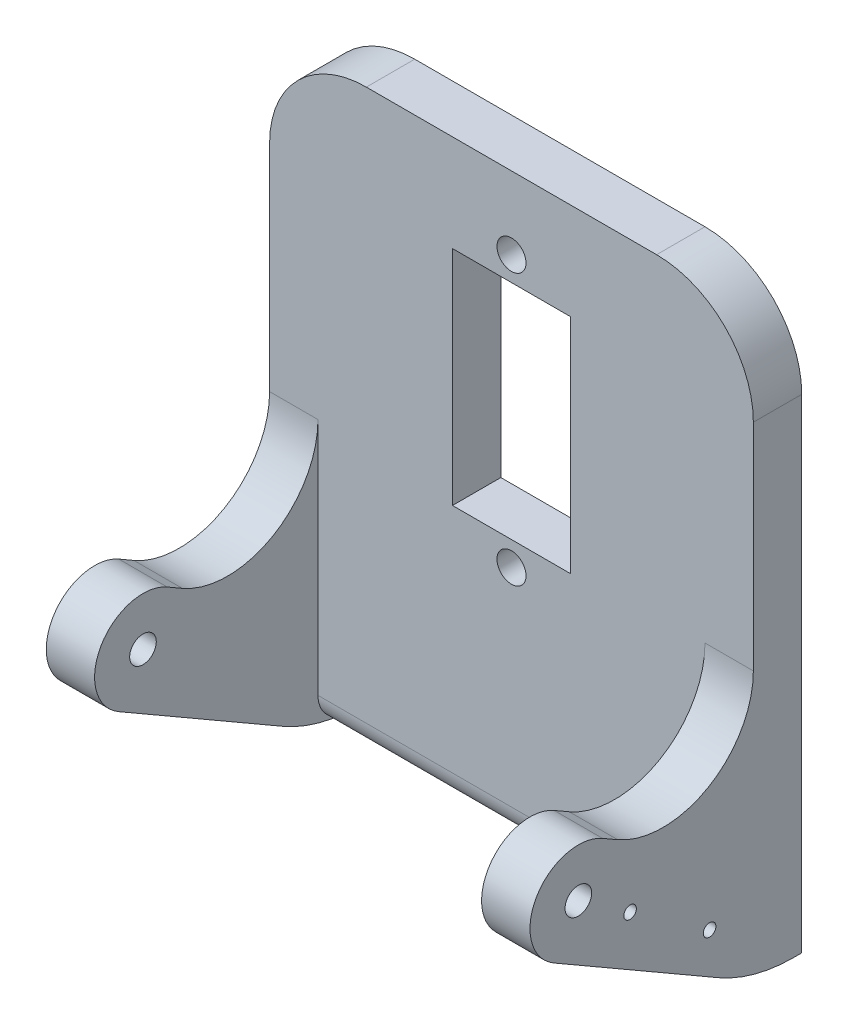
ISO-10303-21;
HEADER;
FILE_DESCRIPTION(('STEP AP214'),'2;1');
FILE_NAME('part.step','',(''),(''),'','','');
FILE_SCHEMA(('AUTOMOTIVE_DESIGN { 1 0 10303 214 1 1 1 1 }'));
ENDSEC;
DATA;
#1=APPLICATION_CONTEXT('core data for automotive mechanical design processes');
#2=APPLICATION_PROTOCOL_DEFINITION('international standard','automotive_design',2000,#1);
#3=PRODUCT_CONTEXT('',#1,'mechanical');
#4=PRODUCT('Part','Part','',(#3));
#5=PRODUCT_RELATED_PRODUCT_CATEGORY('part','',(#4));
#6=PRODUCT_DEFINITION_FORMATION('','',#4);
#7=PRODUCT_DEFINITION_CONTEXT('part definition',#1,'design');
#8=PRODUCT_DEFINITION('design','',#6,#7);
#9=PRODUCT_DEFINITION_SHAPE('','',#8);
#10=(LENGTH_UNIT() NAMED_UNIT(*) SI_UNIT(.MILLI.,.METRE.));
#11=(NAMED_UNIT(*) PLANE_ANGLE_UNIT() SI_UNIT($,.RADIAN.));
#12=(NAMED_UNIT(*) SI_UNIT($,.STERADIAN.) SOLID_ANGLE_UNIT());
#13=UNCERTAINTY_MEASURE_WITH_UNIT(LENGTH_MEASURE(1.E-05),#10,'distance_accuracy_value','');
#14=(GEOMETRIC_REPRESENTATION_CONTEXT(3) GLOBAL_UNCERTAINTY_ASSIGNED_CONTEXT((#13)) GLOBAL_UNIT_ASSIGNED_CONTEXT((#10,
#11,#12)) REPRESENTATION_CONTEXT('',''));
#15=CARTESIAN_POINT('',(0.,0.,0.));
#16=DIRECTION('',(0.,0.,1.));
#17=DIRECTION('',(1.,0.,0.));
#18=AXIS2_PLACEMENT_3D('',#15,#16,#17);
#19=CARTESIAN_POINT('',(-20.,-14.5,0.846787517317614));
#20=DIRECTION('',(1.,0.,0.));
#21=DIRECTION('',(0.,0.,-1.));
#22=AXIS2_PLACEMENT_3D('',#19,#20,#21);
#23=CYLINDRICAL_SURFACE('',#22,15.5);
#24=CARTESIAN_POINT('',(20.,-14.5,0.846787517317622));
#25=DIRECTION('',(-1.,0.,0.));
#26=DIRECTION('',(0.,0.,1.));
#27=AXIS2_PLACEMENT_3D('',#24,#25,#26);
#28=CIRCLE('',#27,15.5);
#29=CARTESIAN_POINT('',(20.,-29.9338960489937,2.27677099584378));
#30=VERTEX_POINT('',#29);
#31=CARTESIAN_POINT('',(20.,-27.9233937586588,8.59678751731759));
#32=VERTEX_POINT('',#31);
#33=EDGE_CURVE('E394',#30,#32,#28,.T.);
#34=ORIENTED_EDGE('',*,*,#33,.F.);
#35=DIRECTION('',(1.,0.,0.));
#36=VECTOR('',#35,1.);
#37=CARTESIAN_POINT('',(-20.,-29.9338960489937,2.27677099584377));
#38=LINE('',#37,#36);
#39=CARTESIAN_POINT('',(-20.,-29.9338960489937,2.27677099584377));
#40=VERTEX_POINT('',#39);
#41=EDGE_CURVE('E411',#30,#40,#38,.F.);
#42=ORIENTED_EDGE('',*,*,#41,.T.);
#43=CARTESIAN_POINT('',(-20.,-14.5,0.846787517317614));
#44=DIRECTION('',(1.,0.,0.));
#45=DIRECTION('',(0.,0.,-1.));
#46=AXIS2_PLACEMENT_3D('',#43,#44,#45);
#47=CIRCLE('',#46,15.5);
#48=CARTESIAN_POINT('',(-20.,-27.9233937586588,8.59678751731758));
#49=VERTEX_POINT('',#48);
#50=EDGE_CURVE('E392',#49,#40,#47,.T.);
#51=ORIENTED_EDGE('',*,*,#50,.F.);
#52=DIRECTION('',(1.,0.,0.));
#53=VECTOR('',#52,1.);
#54=CARTESIAN_POINT('',(-20.,-27.9233937586588,8.59678751731758));
#55=LINE('',#54,#53);
#56=CARTESIAN_POINT('',(-25.,-27.9233937586588,8.59678751731758));
#57=VERTEX_POINT('',#56);
#58=EDGE_CURVE('E384',#57,#49,#55,.T.);
#59=ORIENTED_EDGE('',*,*,#58,.F.);
#60=CARTESIAN_POINT('',(-25.,-14.5,0.846787517317613));
#61=DIRECTION('',(1.,0.,0.));
#62=DIRECTION('',(0.,1.,0.));
#63=AXIS2_PLACEMENT_3D('',#60,#61,#62);
#64=CIRCLE('',#63,15.5);
#65=CARTESIAN_POINT('',(-25.,-30.,0.846787517317624));
#66=VERTEX_POINT('',#65);
#67=EDGE_CURVE('E406',#66,#57,#64,.F.);
#68=ORIENTED_EDGE('',*,*,#67,.F.);
#69=DIRECTION('',(1.,0.,0.));
#70=VECTOR('',#69,1.);
#71=CARTESIAN_POINT('',(-25.,-30.,0.846787517317614));
#72=LINE('',#71,#70);
#73=CARTESIAN_POINT('',(25.,-30.,0.846787517317632));
#74=VERTEX_POINT('',#73);
#75=EDGE_CURVE('E403',#74,#66,#72,.F.);
#76=ORIENTED_EDGE('',*,*,#75,.F.);
#77=CARTESIAN_POINT('',(25.,-14.5,0.846787517317623));
#78=DIRECTION('',(-1.,0.,0.));
#79=DIRECTION('',(0.,-1.,0.));
#80=AXIS2_PLACEMENT_3D('',#77,#78,#79);
#81=CIRCLE('',#80,15.5);
#82=CARTESIAN_POINT('',(25.,-27.9233937586588,8.59678751731759));
#83=VERTEX_POINT('',#82);
#84=EDGE_CURVE('E400',#83,#74,#81,.F.);
#85=ORIENTED_EDGE('',*,*,#84,.F.);
#86=DIRECTION('',(1.,0.,0.));
#87=VECTOR('',#86,1.);
#88=CARTESIAN_POINT('',(-20.,-27.9233937586588,8.59678751731758));
#89=LINE('',#88,#87);
#90=EDGE_CURVE('E397',#32,#83,#89,.T.);
#91=ORIENTED_EDGE('',*,*,#90,.F.);
#92=EDGE_LOOP('',(#34,#42,#51,#59,#68,#76,#85,#91));
#93=FACE_BOUND('',#92,.T.);
#94=ADVANCED_FACE('F35',(#93),#23,.T.);
#95=CARTESIAN_POINT('',(0.,-2.25831956543856,14.35));
#96=DIRECTION('',(1.,0.,0.));
#97=DIRECTION('',(0.,1.,0.));
#98=AXIS2_PLACEMENT_3D('',#95,#96,#97);
#99=CYLINDRICAL_SURFACE('',#98,9.35);
#100=DIRECTION('',(1.,0.,0.));
#101=VECTOR('',#100,1.);
#102=CARTESIAN_POINT('',(0.,-2.25831956543856,5.));
#103=LINE('',#102,#101);
#104=CARTESIAN_POINT('',(-25.,-2.25831956543855,5.));
#105=VERTEX_POINT('',#104);
#106=CARTESIAN_POINT('',(-20.,-2.25831956543855,5.));
#107=VERTEX_POINT('',#106);
#108=EDGE_CURVE('E373',#105,#107,#103,.T.);
#109=ORIENTED_EDGE('',*,*,#108,.F.);
#110=CARTESIAN_POINT('',(-25.,-2.25831956543855,14.35));
#111=DIRECTION('',(1.,0.,0.));
#112=DIRECTION('',(0.,1.,0.));
#113=AXIS2_PLACEMENT_3D('',#110,#111,#112);
#114=CIRCLE('',#113,9.35);
#115=CARTESIAN_POINT('',(-25.,-10.3556570908231,19.025));
#116=VERTEX_POINT('',#115);
#117=EDGE_CURVE('E379',#105,#116,#114,.F.);
#118=ORIENTED_EDGE('',*,*,#117,.T.);
#119=DIRECTION('',(1.,0.,0.));
#120=VECTOR('',#119,1.);
#121=CARTESIAN_POINT('',(-20.,-10.3556570908231,19.025));
#122=LINE('',#121,#120);
#123=CARTESIAN_POINT('',(-20.,-10.3556570908231,19.025));
#124=VERTEX_POINT('',#123);
#125=EDGE_CURVE('E376',#124,#116,#122,.F.);
#126=ORIENTED_EDGE('',*,*,#125,.F.);
#127=CARTESIAN_POINT('',(-20.,-2.25831956543855,14.35));
#128=DIRECTION('',(1.,0.,0.));
#129=DIRECTION('',(0.,0.,-1.));
#130=AXIS2_PLACEMENT_3D('',#127,#128,#129);
#131=CIRCLE('',#130,9.35);
#132=EDGE_CURVE('E381',#124,#107,#131,.T.);
#133=ORIENTED_EDGE('',*,*,#132,.T.);
#134=EDGE_LOOP('',(#109,#118,#126,#133));
#135=FACE_BOUND('',#134,.T.);
#136=ADVANCED_FACE('F460',(#135),#99,.F.);
#137=CARTESIAN_POINT('',(-25.,-13.7831216351297,23.0884572681199));
#138=DIRECTION('',(-1.,0.,0.));
#139=DIRECTION('',(0.,-1.,0.));
#140=AXIS2_PLACEMENT_3D('',#137,#138,#139);
#141=CYLINDRICAL_SURFACE('',#140,5.);
#142=DIRECTION('',(-1.,0.,0.));
#143=VECTOR('',#142,1.);
#144=CARTESIAN_POINT('',(-20.,-9.45299461620754,20.5884572681199));
#145=LINE('',#144,#143);
#146=CARTESIAN_POINT('',(-25.,-9.45299461620754,20.5884572681199));
#147=VERTEX_POINT('',#146);
#148=CARTESIAN_POINT('',(-20.,-9.45299461620754,20.5884572681199));
#149=VERTEX_POINT('',#148);
#150=EDGE_CURVE('E353',#147,#149,#145,.F.);
#151=ORIENTED_EDGE('',*,*,#150,.F.);
#152=CARTESIAN_POINT('',(-25.,-13.7831216351297,23.0884572681199));
#153=DIRECTION('',(1.,0.,0.));
#154=DIRECTION('',(0.,1.,0.));
#155=AXIS2_PLACEMENT_3D('',#152,#153,#154);
#156=CIRCLE('',#155,5.);
#157=CARTESIAN_POINT('',(-25.,-18.1132486540519,25.5884572681199));
#158=VERTEX_POINT('',#157);
#159=EDGE_CURVE('E368',#158,#147,#156,.F.);
#160=ORIENTED_EDGE('',*,*,#159,.F.);
#161=DIRECTION('',(-1.,0.,0.));
#162=VECTOR('',#161,1.);
#163=CARTESIAN_POINT('',(-20.,-18.1132486540519,25.5884572681199));
#164=LINE('',#163,#162);
#165=CARTESIAN_POINT('',(-20.,-18.1132486540519,25.5884572681199));
#166=VERTEX_POINT('',#165);
#167=EDGE_CURVE('E365',#166,#158,#164,.T.);
#168=ORIENTED_EDGE('',*,*,#167,.F.);
#169=CARTESIAN_POINT('',(-20.,-13.7831216351297,23.0884572681199));
#170=DIRECTION('',(1.,0.,0.));
#171=DIRECTION('',(0.,0.,-1.));
#172=AXIS2_PLACEMENT_3D('',#169,#170,#171);
#173=CIRCLE('',#172,5.);
#174=EDGE_CURVE('E371',#149,#166,#173,.T.);
#175=ORIENTED_EDGE('',*,*,#174,.F.);
#176=EDGE_LOOP('',(#151,#160,#168,#175));
#177=FACE_BOUND('',#176,.T.);
#178=ADVANCED_FACE('F466',(#177),#141,.T.);
#179=CARTESIAN_POINT('',(0.,0.,5.));
#180=DIRECTION('',(0.,0.,1.));
#181=DIRECTION('',(1.,0.,0.));
#182=AXIS2_PLACEMENT_3D('',#179,#180,#181);
#183=PLANE('',#182);
#184=CARTESIAN_POINT('',(0.,-5.50000000000001,5.));
#185=DIRECTION('',(0.,0.,-1.));
#186=DIRECTION('',(-1.,0.,0.));
#187=AXIS2_PLACEMENT_3D('',#184,#185,#186);
#188=CIRCLE('',#187,1.5);
#189=CARTESIAN_POINT('',(-1.50000000000001,-5.50000000000001,5.));
#190=VERTEX_POINT('',#189);
#191=EDGE_CURVE('E268',#190,#190,#188,.T.);
#192=ORIENTED_EDGE('',*,*,#191,.T.);
#193=EDGE_LOOP('',(#192));
#194=FACE_BOUND('',#193,.T.);
#195=CARTESIAN_POINT('',(0.,22.5,5.));
#196=DIRECTION('',(0.,0.,-1.));
#197=DIRECTION('',(-1.,0.,0.));
#198=AXIS2_PLACEMENT_3D('',#195,#196,#197);
#199=CIRCLE('',#198,1.5);
#200=CARTESIAN_POINT('',(-1.50000000000001,22.5,5.));
#201=VERTEX_POINT('',#200);
#202=EDGE_CURVE('E275',#201,#201,#199,.T.);
#203=ORIENTED_EDGE('',*,*,#202,.T.);
#204=EDGE_LOOP('',(#203));
#205=FACE_BOUND('',#204,.T.);
#206=DIRECTION('',(0.,1.,0.));
#207=VECTOR('',#206,1.);
#208=CARTESIAN_POINT('',(6.1,-3.,5.));
#209=LINE('',#208,#207);
#210=CARTESIAN_POINT('',(6.1,-3.,5.));
#211=VERTEX_POINT('',#210);
#212=CARTESIAN_POINT('',(6.1,20.,5.));
#213=VERTEX_POINT('',#212);
#214=EDGE_CURVE('E271',#211,#213,#209,.T.);
#215=ORIENTED_EDGE('',*,*,#214,.F.);
#216=DIRECTION('',(1.,0.,0.));
#217=VECTOR('',#216,1.);
#218=CARTESIAN_POINT('',(6.1,-3.,5.));
#219=LINE('',#218,#217);
#220=CARTESIAN_POINT('',(-6.10000000000001,-3.,5.));
#221=VERTEX_POINT('',#220);
#222=EDGE_CURVE('E284',#221,#211,#219,.T.);
#223=ORIENTED_EDGE('',*,*,#222,.F.);
#224=DIRECTION('',(0.,-1.,0.));
#225=VECTOR('',#224,1.);
#226=CARTESIAN_POINT('',(-6.10000000000001,-3.,5.));
#227=LINE('',#226,#225);
#228=CARTESIAN_POINT('',(-6.10000000000001,20.,5.));
#229=VERTEX_POINT('',#228);
#230=EDGE_CURVE('E298',#229,#221,#227,.T.);
#231=ORIENTED_EDGE('',*,*,#230,.F.);
#232=DIRECTION('',(-1.,0.,0.));
#233=VECTOR('',#232,1.);
#234=CARTESIAN_POINT('',(6.1,20.,5.));
#235=LINE('',#234,#233);
#236=EDGE_CURVE('E295',#213,#229,#235,.T.);
#237=ORIENTED_EDGE('',*,*,#236,.F.);
#238=EDGE_LOOP('',(#215,#223,#231,#237));
#239=FACE_BOUND('',#238,.T.);
#240=DIRECTION('',(0.,1.,0.));
#241=VECTOR('',#240,1.);
#242=CARTESIAN_POINT('',(25.,30.,5.));
#243=LINE('',#242,#241);
#244=CARTESIAN_POINT('',(25.,-2.25831956543855,5.));
#245=VERTEX_POINT('',#244);
#246=CARTESIAN_POINT('',(25.,20.,5.));
#247=VERTEX_POINT('',#246);
#248=EDGE_CURVE('E312',#245,#247,#243,.T.);
#249=ORIENTED_EDGE('',*,*,#248,.T.);
#250=CARTESIAN_POINT('',(15.,20.,5.));
#251=DIRECTION('',(0.,0.,1.));
#252=DIRECTION('',(1.,0.,0.));
#253=AXIS2_PLACEMENT_3D('',#250,#251,#252);
#254=CIRCLE('',#253,10.);
#255=CARTESIAN_POINT('',(15.,30.,5.));
#256=VERTEX_POINT('',#255);
#257=EDGE_CURVE('E43',#247,#256,#254,.T.);
#258=ORIENTED_EDGE('',*,*,#257,.T.);
#259=DIRECTION('',(-1.,0.,0.));
#260=VECTOR('',#259,1.);
#261=CARTESIAN_POINT('',(-25.,30.,5.));
#262=LINE('',#261,#260);
#263=CARTESIAN_POINT('',(-15.,30.,5.));
#264=VERTEX_POINT('',#263);
#265=EDGE_CURVE('E314',#256,#264,#262,.T.);
#266=ORIENTED_EDGE('',*,*,#265,.T.);
#267=CARTESIAN_POINT('',(-15.,20.,5.));
#268=DIRECTION('',(0.,0.,1.));
#269=DIRECTION('',(1.,0.,0.));
#270=AXIS2_PLACEMENT_3D('',#267,#268,#269);
#271=CIRCLE('',#270,10.);
#272=CARTESIAN_POINT('',(-25.,20.,5.));
#273=VERTEX_POINT('',#272);
#274=EDGE_CURVE('E50',#264,#273,#271,.T.);
#275=ORIENTED_EDGE('',*,*,#274,.T.);
#276=DIRECTION('',(0.,-1.,0.));
#277=VECTOR('',#276,1.);
#278=CARTESIAN_POINT('',(-25.,30.,5.));
#279=LINE('',#278,#277);
#280=EDGE_CURVE('E317',#273,#105,#279,.T.);
#281=ORIENTED_EDGE('',*,*,#280,.T.);
#282=ORIENTED_EDGE('',*,*,#108,.T.);
#283=DIRECTION('',(0.,1.,0.));
#284=VECTOR('',#283,1.);
#285=CARTESIAN_POINT('',(-20.,-30.,5.));
#286=LINE('',#285,#284);
#287=CARTESIAN_POINT('',(-20.,-26.9466903620917,5.00000000000001));
#288=VERTEX_POINT('',#287);
#289=EDGE_CURVE('E486',#288,#107,#286,.T.);
#290=ORIENTED_EDGE('',*,*,#289,.F.);
#291=DIRECTION('',(1.,0.,0.));
#292=VECTOR('',#291,1.);
#293=CARTESIAN_POINT('',(0.,-26.9466903620917,5.));
#294=LINE('',#293,#292);
#295=CARTESIAN_POINT('',(20.,-26.9466903620917,5.00000000000001));
#296=VERTEX_POINT('',#295);
#297=EDGE_CURVE('E408',#288,#296,#294,.T.);
#298=ORIENTED_EDGE('',*,*,#297,.T.);
#299=DIRECTION('',(0.,1.,0.));
#300=VECTOR('',#299,1.);
#301=CARTESIAN_POINT('',(20.,-30.,5.));
#302=LINE('',#301,#300);
#303=CARTESIAN_POINT('',(20.,-2.25831956543855,5.));
#304=VERTEX_POINT('',#303);
#305=EDGE_CURVE('E256',#296,#304,#302,.T.);
#306=ORIENTED_EDGE('',*,*,#305,.T.);
#307=DIRECTION('',(1.,0.,0.));
#308=VECTOR('',#307,1.);
#309=CARTESIAN_POINT('',(0.,-2.25831956543856,5.));
#310=LINE('',#309,#308);
#311=EDGE_CURVE('E343',#304,#245,#310,.T.);
#312=ORIENTED_EDGE('',*,*,#311,.T.);
#313=EDGE_LOOP('',(#249,#258,#266,#275,#281,#282,#290,#298,#306,#312));
#314=FACE_BOUND('',#313,.T.);
#315=ADVANCED_FACE('F431',(#194,#205,#239,#314),#183,.T.);
#316=CARTESIAN_POINT('',(20.,0.,0.));
#317=DIRECTION('',(-1.,0.,0.));
#318=DIRECTION('',(0.,0.,1.));
#319=AXIS2_PLACEMENT_3D('',#316,#317,#318);
#320=PLANE('',#319);
#321=ORIENTED_EDGE('',*,*,#305,.F.);
#322=CARTESIAN_POINT('',(20.,-26.9466903620917,2.00000000000001));
#323=DIRECTION('',(-1.,0.,0.));
#324=DIRECTION('',(0.,0.,1.));
#325=AXIS2_PLACEMENT_3D('',#322,#323,#324);
#326=CIRCLE('',#325,3.);
#327=EDGE_CURVE('E414',#296,#30,#326,.F.);
#328=ORIENTED_EDGE('',*,*,#327,.T.);
#329=ORIENTED_EDGE('',*,*,#33,.T.);
#330=DIRECTION('',(0.,-0.499999999999998,-0.86602540378444));
#331=VECTOR('',#330,1.);
#332=CARTESIAN_POINT('',(20.,-30.,5.));
#333=LINE('',#332,#331);
#334=CARTESIAN_POINT('',(20.,-18.1132486540519,25.5884572681199));
#335=VERTEX_POINT('',#334);
#336=EDGE_CURVE('E261',#335,#32,#333,.T.);
#337=ORIENTED_EDGE('',*,*,#336,.F.);
#338=CARTESIAN_POINT('',(20.,-13.7831216351297,23.0884572681199));
#339=DIRECTION('',(-1.,0.,0.));
#340=DIRECTION('',(0.,0.,1.));
#341=AXIS2_PLACEMENT_3D('',#338,#339,#340);
#342=CIRCLE('',#341,5.);
#343=CARTESIAN_POINT('',(20.,-9.45299461620754,20.5884572681199));
#344=VERTEX_POINT('',#343);
#345=EDGE_CURVE('E338',#335,#344,#342,.T.);
#346=ORIENTED_EDGE('',*,*,#345,.T.);
#347=DIRECTION('',(0.,0.499999999999998,0.86602540378444));
#348=VECTOR('',#347,1.);
#349=CARTESIAN_POINT('',(20.,-6.95299461620754,24.9185842870421));
#350=LINE('',#349,#348);
#351=CARTESIAN_POINT('',(20.,-10.3556570908231,19.025));
#352=VERTEX_POINT('',#351);
#353=EDGE_CURVE('E258',#352,#344,#350,.T.);
#354=ORIENTED_EDGE('',*,*,#353,.F.);
#355=CARTESIAN_POINT('',(20.,-2.25831956543855,14.35));
#356=DIRECTION('',(-1.,0.,0.));
#357=DIRECTION('',(0.,0.,1.));
#358=AXIS2_PLACEMENT_3D('',#355,#356,#357);
#359=CIRCLE('',#358,9.35);
#360=EDGE_CURVE('E349',#304,#352,#359,.T.);
#361=ORIENTED_EDGE('',*,*,#360,.F.);
#362=EDGE_LOOP('',(#321,#328,#329,#337,#346,#354,#361));
#363=FACE_BOUND('',#362,.T.);
#364=CARTESIAN_POINT('',(20.,-22.9909247677209,9.79007441638017));
#365=DIRECTION('',(-1.,0.,0.));
#366=DIRECTION('',(0.,0.,1.));
#367=AXIS2_PLACEMENT_3D('',#364,#365,#366);
#368=CIRCLE('',#367,1.91571476111171);
#369=CARTESIAN_POINT('',(20.,-21.5168959497368,8.56647232023378));
#370=VERTEX_POINT('',#369);
#371=CARTESIAN_POINT('',(20.,-24.6532831653106,10.7421918481626));
#372=VERTEX_POINT('',#371);
#373=EDGE_CURVE('E242',#370,#372,#368,.T.);
#374=ORIENTED_EDGE('',*,*,#373,.F.);
#375=DIRECTION('',(0.,0.638718310776219,0.769440653643394));
#376=VECTOR('',#375,1.);
#377=CARTESIAN_POINT('',(20.,-16.9488826318122,14.0693913596522));
#378=LINE('',#377,#376);
#379=CARTESIAN_POINT('',(20.,-11.2249027921388,20.9648611073842));
#380=VERTEX_POINT('',#379);
#381=EDGE_CURVE('E216',#370,#380,#378,.T.);
#382=ORIENTED_EDGE('',*,*,#381,.T.);
#383=CARTESIAN_POINT('',(20.,-13.7831216351297,23.0884572681199));
#384=DIRECTION('',(-1.,0.,0.));
#385=DIRECTION('',(0.,0.,1.));
#386=AXIS2_PLACEMENT_3D('',#383,#384,#385);
#387=CIRCLE('',#386,3.32477733126974);
#388=CARTESIAN_POINT('',(20.,-16.85892840058,24.3508189611917));
#389=VERTEX_POINT('',#388);
#390=EDGE_CURVE('E231',#389,#380,#387,.T.);
#391=ORIENTED_EDGE('',*,*,#390,.F.);
#392=DIRECTION('',(0.,0.497003756044566,0.8677483889225));
#393=VECTOR('',#392,1.);
#394=CARTESIAN_POINT('',(20.,-23.1964385882492,13.2857833588518));
#395=LINE('',#394,#393);
#396=EDGE_CURVE('E245',#372,#389,#395,.T.);
#397=ORIENTED_EDGE('',*,*,#396,.F.);
#398=EDGE_LOOP('',(#374,#382,#391,#397));
#399=FACE_BOUND('',#398,.T.);
#400=ADVANCED_FACE('F538',(#363,#399),#320,.T.);
#401=CARTESIAN_POINT('',(0.,-2.25831956543856,14.35));
#402=DIRECTION('',(-1.,0.,0.));
#403=DIRECTION('',(0.,-1.,0.));
#404=AXIS2_PLACEMENT_3D('',#401,#402,#403);
#405=CYLINDRICAL_SURFACE('',#404,9.35);
#406=ORIENTED_EDGE('',*,*,#311,.F.);
#407=ORIENTED_EDGE('',*,*,#360,.T.);
#408=DIRECTION('',(1.,0.,0.));
#409=VECTOR('',#408,1.);
#410=CARTESIAN_POINT('',(0.,-10.3556570908231,19.025));
#411=LINE('',#410,#409);
#412=CARTESIAN_POINT('',(25.,-10.3556570908231,19.025));
#413=VERTEX_POINT('',#412);
#414=EDGE_CURVE('E346',#413,#352,#411,.F.);
#415=ORIENTED_EDGE('',*,*,#414,.F.);
#416=CARTESIAN_POINT('',(25.,-2.25831956543855,14.35));
#417=DIRECTION('',(-1.,0.,0.));
#418=DIRECTION('',(0.,-1.,0.));
#419=AXIS2_PLACEMENT_3D('',#416,#417,#418);
#420=CIRCLE('',#419,9.35);
#421=EDGE_CURVE('E351',#413,#245,#420,.F.);
#422=ORIENTED_EDGE('',*,*,#421,.T.);
#423=EDGE_LOOP('',(#406,#407,#415,#422));
#424=FACE_BOUND('',#423,.T.);
#425=ADVANCED_FACE('F541',(#424),#405,.F.);
#426=CARTESIAN_POINT('',(20.,-13.7831216351297,23.0884572681199));
#427=DIRECTION('',(1.,0.,0.));
#428=DIRECTION('',(0.,1.,0.));
#429=AXIS2_PLACEMENT_3D('',#426,#427,#428);
#430=CYLINDRICAL_SURFACE('',#429,5.);
#431=DIRECTION('',(1.,0.,0.));
#432=VECTOR('',#431,1.);
#433=CARTESIAN_POINT('',(20.,-9.45299461620754,20.5884572681199));
#434=LINE('',#433,#432);
#435=CARTESIAN_POINT('',(25.,-9.45299461620754,20.5884572681199));
#436=VERTEX_POINT('',#435);
#437=EDGE_CURVE('E332',#344,#436,#434,.T.);
#438=ORIENTED_EDGE('',*,*,#437,.F.);
#439=ORIENTED_EDGE('',*,*,#345,.F.);
#440=DIRECTION('',(1.,0.,0.));
#441=VECTOR('',#440,1.);
#442=CARTESIAN_POINT('',(20.,-18.1132486540519,25.5884572681199));
#443=LINE('',#442,#441);
#444=CARTESIAN_POINT('',(25.,-18.1132486540519,25.5884572681199));
#445=VERTEX_POINT('',#444);
#446=EDGE_CURVE('E335',#445,#335,#443,.F.);
#447=ORIENTED_EDGE('',*,*,#446,.F.);
#448=CARTESIAN_POINT('',(25.,-13.7831216351297,23.0884572681199));
#449=DIRECTION('',(-1.,0.,0.));
#450=DIRECTION('',(0.,-1.,0.));
#451=AXIS2_PLACEMENT_3D('',#448,#449,#450);
#452=CIRCLE('',#451,5.);
#453=EDGE_CURVE('E341',#436,#445,#452,.F.);
#454=ORIENTED_EDGE('',*,*,#453,.F.);
#455=EDGE_LOOP('',(#438,#439,#447,#454));
#456=FACE_BOUND('',#455,.T.);
#457=ADVANCED_FACE('F589',(#456),#430,.T.);
#458=CARTESIAN_POINT('',(25.,30.,5.));
#459=DIRECTION('',(-1.,0.,0.));
#460=DIRECTION('',(0.,-1.,0.));
#461=AXIS2_PLACEMENT_3D('',#458,#459,#460);
#462=PLANE('',#461);
#463=CARTESIAN_POINT('',(25.,-23.1759347224715,9.52287352445959));
#464=DIRECTION('',(-1.,0.,0.));
#465=DIRECTION('',(0.,0.,1.));
#466=AXIS2_PLACEMENT_3D('',#463,#464,#465);
#467=CIRCLE('',#466,0.649999999999279);
#468=CARTESIAN_POINT('',(25.,-23.1759347224715,10.1728735244589));
#469=VERTEX_POINT('',#468);
#470=EDGE_CURVE('E358',#469,#469,#467,.T.);
#471=ORIENTED_EDGE('',*,*,#470,.T.);
#472=EDGE_LOOP('',(#471));
#473=FACE_BOUND('',#472,.T.);
#474=CARTESIAN_POINT('',(25.,-17.4833207301432,17.7444394297083));
#475=DIRECTION('',(-1.,0.,0.));
#476=DIRECTION('',(0.,0.,1.));
#477=AXIS2_PLACEMENT_3D('',#474,#475,#476);
#478=CIRCLE('',#477,0.649999999999293);
#479=CARTESIAN_POINT('',(25.,-17.4833207301432,18.3944394297076));
#480=VERTEX_POINT('',#479);
#481=EDGE_CURVE('E503',#480,#480,#478,.T.);
#482=ORIENTED_EDGE('',*,*,#481,.T.);
#483=EDGE_LOOP('',(#482));
#484=FACE_BOUND('',#483,.T.);
#485=CARTESIAN_POINT('',(25.,-13.7831216351297,23.0884572681199));
#486=DIRECTION('',(-1.,0.,0.));
#487=DIRECTION('',(0.,0.,1.));
#488=AXIS2_PLACEMENT_3D('',#485,#486,#487);
#489=CIRCLE('',#488,1.37499999999931);
#490=CARTESIAN_POINT('',(25.,-13.7831216351297,24.4634572681192));
#491=VERTEX_POINT('',#490);
#492=EDGE_CURVE('E498',#491,#491,#489,.T.);
#493=ORIENTED_EDGE('',*,*,#492,.T.);
#494=EDGE_LOOP('',(#493));
#495=FACE_BOUND('',#494,.T.);
#496=DIRECTION('',(0.,1.,0.));
#497=VECTOR('',#496,1.);
#498=CARTESIAN_POINT('',(25.,30.,0.));
#499=LINE('',#498,#497);
#500=CARTESIAN_POINT('',(25.,-30.,0.));
#501=VERTEX_POINT('',#500);
#502=CARTESIAN_POINT('',(25.,20.,0.));
#503=VERTEX_POINT('',#502);
#504=EDGE_CURVE('E305',#501,#503,#499,.T.);
#505=ORIENTED_EDGE('',*,*,#504,.T.);
#506=DIRECTION('',(0.,0.,-1.));
#507=VECTOR('',#506,1.);
#508=CARTESIAN_POINT('',(25.,20.,5.));
#509=LINE('',#508,#507);
#510=EDGE_CURVE('E58',#503,#247,#509,.F.);
#511=ORIENTED_EDGE('',*,*,#510,.T.);
#512=ORIENTED_EDGE('',*,*,#248,.F.);
#513=ORIENTED_EDGE('',*,*,#421,.F.);
#514=DIRECTION('',(0.,0.499999999999998,0.86602540378444));
#515=VECTOR('',#514,1.);
#516=CARTESIAN_POINT('',(25.,-6.95299461620754,24.9185842870421));
#517=LINE('',#516,#515);
#518=EDGE_CURVE('E252',#413,#436,#517,.T.);
#519=ORIENTED_EDGE('',*,*,#518,.T.);
#520=ORIENTED_EDGE('',*,*,#453,.T.);
#521=DIRECTION('',(0.,-0.499999999999998,-0.86602540378444));
#522=VECTOR('',#521,1.);
#523=CARTESIAN_POINT('',(25.,-30.,5.));
#524=LINE('',#523,#522);
#525=EDGE_CURVE('E259',#445,#83,#524,.T.);
#526=ORIENTED_EDGE('',*,*,#525,.T.);
#527=ORIENTED_EDGE('',*,*,#84,.T.);
#528=DIRECTION('',(0.,0.,-1.));
#529=VECTOR('',#528,1.);
#530=CARTESIAN_POINT('',(25.,-30.,5.));
#531=LINE('',#530,#529);
#532=EDGE_CURVE('E319',#74,#501,#531,.T.);
#533=ORIENTED_EDGE('',*,*,#532,.T.);
#534=EDGE_LOOP('',(#505,#511,#512,#513,#519,#520,#526,#527,#533));
#535=FACE_BOUND('',#534,.T.);
#536=ADVANCED_FACE('F443',(#473,#484,#495,#535),#462,.F.);
#537=CARTESIAN_POINT('',(-25.,30.,5.));
#538=DIRECTION('',(0.,-1.,0.));
#539=DIRECTION('',(0.,0.,-1.));
#540=AXIS2_PLACEMENT_3D('',#537,#538,#539);
#541=PLANE('',#540);
#542=ORIENTED_EDGE('',*,*,#265,.F.);
#543=DIRECTION('',(0.,0.,-1.));
#544=VECTOR('',#543,1.);
#545=CARTESIAN_POINT('',(15.,30.,5.));
#546=LINE('',#545,#544);
#547=CARTESIAN_POINT('',(15.,30.,0.));
#548=VERTEX_POINT('',#547);
#549=EDGE_CURVE('E421',#256,#548,#546,.T.);
#550=ORIENTED_EDGE('',*,*,#549,.T.);
#551=DIRECTION('',(-1.,0.,0.));
#552=VECTOR('',#551,1.);
#553=CARTESIAN_POINT('',(-25.,30.,0.));
#554=LINE('',#553,#552);
#555=CARTESIAN_POINT('',(-15.,30.,0.));
#556=VERTEX_POINT('',#555);
#557=EDGE_CURVE('E321',#548,#556,#554,.T.);
#558=ORIENTED_EDGE('',*,*,#557,.T.);
#559=DIRECTION('',(0.,0.,-1.));
#560=VECTOR('',#559,1.);
#561=CARTESIAN_POINT('',(-15.,30.,5.));
#562=LINE('',#561,#560);
#563=EDGE_CURVE('E419',#556,#264,#562,.F.);
#564=ORIENTED_EDGE('',*,*,#563,.T.);
#565=EDGE_LOOP('',(#542,#550,#558,#564));
#566=FACE_BOUND('',#565,.T.);
#567=ADVANCED_FACE('F435',(#566),#541,.F.);
#568=CARTESIAN_POINT('',(-25.,30.,5.));
#569=DIRECTION('',(1.,0.,0.));
#570=DIRECTION('',(0.,1.,0.));
#571=AXIS2_PLACEMENT_3D('',#568,#569,#570);
#572=PLANE('',#571);
#573=CARTESIAN_POINT('',(-25.,-13.7831216351297,23.0884572681199));
#574=DIRECTION('',(-1.,0.,0.));
#575=DIRECTION('',(0.,-1.,0.));
#576=AXIS2_PLACEMENT_3D('',#573,#574,#575);
#577=CIRCLE('',#576,1.37499999999931);
#578=CARTESIAN_POINT('',(-25.,-15.1581216351291,23.0884572681199));
#579=VERTEX_POINT('',#578);
#580=EDGE_CURVE('E389',#579,#579,#577,.T.);
#581=ORIENTED_EDGE('',*,*,#580,.F.);
#582=EDGE_LOOP('',(#581));
#583=FACE_BOUND('',#582,.T.);
#584=ORIENTED_EDGE('',*,*,#280,.F.);
#585=DIRECTION('',(0.,0.,-1.));
#586=VECTOR('',#585,1.);
#587=CARTESIAN_POINT('',(-25.,20.,5.));
#588=LINE('',#587,#586);
#589=CARTESIAN_POINT('',(-25.,20.,0.));
#590=VERTEX_POINT('',#589);
#591=EDGE_CURVE('E11',#273,#590,#588,.T.);
#592=ORIENTED_EDGE('',*,*,#591,.T.);
#593=DIRECTION('',(0.,-1.,0.));
#594=VECTOR('',#593,1.);
#595=CARTESIAN_POINT('',(-25.,30.,0.));
#596=LINE('',#595,#594);
#597=CARTESIAN_POINT('',(-25.,-30.,0.));
#598=VERTEX_POINT('',#597);
#599=EDGE_CURVE('E324',#590,#598,#596,.T.);
#600=ORIENTED_EDGE('',*,*,#599,.T.);
#601=DIRECTION('',(0.,0.,-1.));
#602=VECTOR('',#601,1.);
#603=CARTESIAN_POINT('',(-25.,-30.,5.));
#604=LINE('',#603,#602);
#605=EDGE_CURVE('E329',#66,#598,#604,.T.);
#606=ORIENTED_EDGE('',*,*,#605,.F.);
#607=ORIENTED_EDGE('',*,*,#67,.T.);
#608=DIRECTION('',(0.,-0.499999999999998,-0.86602540378444));
#609=VECTOR('',#608,1.);
#610=CARTESIAN_POINT('',(-25.,-30.,5.));
#611=LINE('',#610,#609);
#612=EDGE_CURVE('E388',#158,#57,#611,.T.);
#613=ORIENTED_EDGE('',*,*,#612,.F.);
#614=ORIENTED_EDGE('',*,*,#159,.T.);
#615=DIRECTION('',(0.,0.499999999999998,0.86602540378444));
#616=VECTOR('',#615,1.);
#617=CARTESIAN_POINT('',(-25.,-6.95299461620754,24.9185842870421));
#618=LINE('',#617,#616);
#619=EDGE_CURVE('E490',#116,#147,#618,.T.);
#620=ORIENTED_EDGE('',*,*,#619,.F.);
#621=ORIENTED_EDGE('',*,*,#117,.F.);
#622=EDGE_LOOP('',(#584,#592,#600,#606,#607,#613,#614,#620,#621));
#623=FACE_BOUND('',#622,.T.);
#624=ADVANCED_FACE('F450',(#583,#623),#572,.F.);
#625=CARTESIAN_POINT('',(-25.,-30.,5.));
#626=DIRECTION('',(0.,1.,0.));
#627=DIRECTION('',(0.,0.,1.));
#628=AXIS2_PLACEMENT_3D('',#625,#626,#627);
#629=PLANE('',#628);
#630=ORIENTED_EDGE('',*,*,#532,.F.);
#631=ORIENTED_EDGE('',*,*,#75,.T.);
#632=ORIENTED_EDGE('',*,*,#605,.T.);
#633=DIRECTION('',(1.,0.,0.));
#634=VECTOR('',#633,1.);
#635=CARTESIAN_POINT('',(-25.,-30.,0.));
#636=LINE('',#635,#634);
#637=EDGE_CURVE('E315',#598,#501,#636,.T.);
#638=ORIENTED_EDGE('',*,*,#637,.T.);
#639=EDGE_LOOP('',(#630,#631,#632,#638));
#640=FACE_BOUND('',#639,.T.);
#641=ADVANCED_FACE('F446',(#640),#629,.F.);
#642=CARTESIAN_POINT('',(0.,0.,0.));
#643=DIRECTION('',(0.,0.,1.));
#644=DIRECTION('',(1.,0.,0.));
#645=AXIS2_PLACEMENT_3D('',#642,#643,#644);
#646=PLANE('',#645);
#647=CARTESIAN_POINT('',(0.,-5.50000000000001,0.));
#648=DIRECTION('',(0.,0.,-1.));
#649=DIRECTION('',(-1.,0.,0.));
#650=AXIS2_PLACEMENT_3D('',#647,#648,#649);
#651=CIRCLE('',#650,1.5);
#652=CARTESIAN_POINT('',(-1.50000000000001,-5.50000000000001,0.));
#653=VERTEX_POINT('',#652);
#654=EDGE_CURVE('E272',#653,#653,#651,.T.);
#655=ORIENTED_EDGE('',*,*,#654,.F.);
#656=EDGE_LOOP('',(#655));
#657=FACE_BOUND('',#656,.T.);
#658=CARTESIAN_POINT('',(0.,22.5,0.));
#659=DIRECTION('',(0.,0.,-1.));
#660=DIRECTION('',(-1.,0.,0.));
#661=AXIS2_PLACEMENT_3D('',#658,#659,#660);
#662=CIRCLE('',#661,1.5);
#663=CARTESIAN_POINT('',(-1.50000000000001,22.5,0.));
#664=VERTEX_POINT('',#663);
#665=EDGE_CURVE('E264',#664,#664,#662,.T.);
#666=ORIENTED_EDGE('',*,*,#665,.F.);
#667=EDGE_LOOP('',(#666));
#668=FACE_BOUND('',#667,.T.);
#669=DIRECTION('',(1.,0.,0.));
#670=VECTOR('',#669,1.);
#671=CARTESIAN_POINT('',(6.1,-3.,0.));
#672=LINE('',#671,#670);
#673=CARTESIAN_POINT('',(-6.10000000000001,-3.,0.));
#674=VERTEX_POINT('',#673);
#675=CARTESIAN_POINT('',(6.1,-3.,0.));
#676=VERTEX_POINT('',#675);
#677=EDGE_CURVE('E290',#674,#676,#672,.T.);
#678=ORIENTED_EDGE('',*,*,#677,.T.);
#679=DIRECTION('',(0.,1.,0.));
#680=VECTOR('',#679,1.);
#681=CARTESIAN_POINT('',(6.1,-3.,0.));
#682=LINE('',#681,#680);
#683=CARTESIAN_POINT('',(6.1,20.,0.));
#684=VERTEX_POINT('',#683);
#685=EDGE_CURVE('E280',#676,#684,#682,.T.);
#686=ORIENTED_EDGE('',*,*,#685,.T.);
#687=DIRECTION('',(-1.,0.,0.));
#688=VECTOR('',#687,1.);
#689=CARTESIAN_POINT('',(6.1,20.,0.));
#690=LINE('',#689,#688);
#691=CARTESIAN_POINT('',(-6.10000000000001,20.,0.));
#692=VERTEX_POINT('',#691);
#693=EDGE_CURVE('E283',#684,#692,#690,.T.);
#694=ORIENTED_EDGE('',*,*,#693,.T.);
#695=DIRECTION('',(0.,-1.,0.));
#696=VECTOR('',#695,1.);
#697=CARTESIAN_POINT('',(-6.10000000000001,-3.,0.));
#698=LINE('',#697,#696);
#699=EDGE_CURVE('E287',#692,#674,#698,.T.);
#700=ORIENTED_EDGE('',*,*,#699,.T.);
#701=EDGE_LOOP('',(#678,#686,#694,#700));
#702=FACE_BOUND('',#701,.T.);
#703=ORIENTED_EDGE('',*,*,#557,.F.);
#704=CARTESIAN_POINT('',(15.,20.,0.));
#705=DIRECTION('',(0.,0.,1.));
#706=DIRECTION('',(1.,0.,0.));
#707=AXIS2_PLACEMENT_3D('',#704,#705,#706);
#708=CIRCLE('',#707,10.);
#709=EDGE_CURVE('E426',#548,#503,#708,.F.);
#710=ORIENTED_EDGE('',*,*,#709,.T.);
#711=ORIENTED_EDGE('',*,*,#504,.F.);
#712=ORIENTED_EDGE('',*,*,#637,.F.);
#713=ORIENTED_EDGE('',*,*,#599,.F.);
#714=CARTESIAN_POINT('',(-15.,20.,0.));
#715=DIRECTION('',(0.,0.,1.));
#716=DIRECTION('',(1.,0.,0.));
#717=AXIS2_PLACEMENT_3D('',#714,#715,#716);
#718=CIRCLE('',#717,10.);
#719=EDGE_CURVE('E424',#590,#556,#718,.F.);
#720=ORIENTED_EDGE('',*,*,#719,.T.);
#721=EDGE_LOOP('',(#703,#710,#711,#712,#713,#720));
#722=FACE_BOUND('',#721,.T.);
#723=ADVANCED_FACE('F441',(#657,#668,#702,#722),#646,.F.);
#724=CARTESIAN_POINT('',(6.1,-3.,0.));
#725=DIRECTION('',(1.,0.,0.));
#726=DIRECTION('',(0.,0.,-1.));
#727=AXIS2_PLACEMENT_3D('',#724,#725,#726);
#728=PLANE('',#727);
#729=ORIENTED_EDGE('',*,*,#214,.T.);
#730=DIRECTION('',(0.,0.,1.));
#731=VECTOR('',#730,1.);
#732=CARTESIAN_POINT('',(6.1,20.,0.));
#733=LINE('',#732,#731);
#734=EDGE_CURVE('E293',#684,#213,#733,.T.);
#735=ORIENTED_EDGE('',*,*,#734,.F.);
#736=ORIENTED_EDGE('',*,*,#685,.F.);
#737=DIRECTION('',(0.,0.,1.));
#738=VECTOR('',#737,1.);
#739=CARTESIAN_POINT('',(6.1,-3.,0.));
#740=LINE('',#739,#738);
#741=EDGE_CURVE('E303',#676,#211,#740,.T.);
#742=ORIENTED_EDGE('',*,*,#741,.T.);
#743=EDGE_LOOP('',(#729,#735,#736,#742));
#744=FACE_BOUND('',#743,.T.);
#745=ADVANCED_FACE('F563',(#744),#728,.F.);
#746=CARTESIAN_POINT('',(6.1,-3.,0.));
#747=DIRECTION('',(0.,-1.,0.));
#748=DIRECTION('',(0.,0.,-1.));
#749=AXIS2_PLACEMENT_3D('',#746,#747,#748);
#750=PLANE('',#749);
#751=ORIENTED_EDGE('',*,*,#222,.T.);
#752=ORIENTED_EDGE('',*,*,#741,.F.);
#753=ORIENTED_EDGE('',*,*,#677,.F.);
#754=DIRECTION('',(0.,0.,1.));
#755=VECTOR('',#754,1.);
#756=CARTESIAN_POINT('',(-6.10000000000001,-3.,0.));
#757=LINE('',#756,#755);
#758=EDGE_CURVE('E306',#674,#221,#757,.T.);
#759=ORIENTED_EDGE('',*,*,#758,.T.);
#760=EDGE_LOOP('',(#751,#752,#753,#759));
#761=FACE_BOUND('',#760,.T.);
#762=ADVANCED_FACE('F559',(#761),#750,.F.);
#763=CARTESIAN_POINT('',(-6.10000000000001,-3.,0.));
#764=DIRECTION('',(-1.,0.,0.));
#765=DIRECTION('',(0.,0.,1.));
#766=AXIS2_PLACEMENT_3D('',#763,#764,#765);
#767=PLANE('',#766);
#768=ORIENTED_EDGE('',*,*,#230,.T.);
#769=ORIENTED_EDGE('',*,*,#758,.F.);
#770=ORIENTED_EDGE('',*,*,#699,.F.);
#771=DIRECTION('',(0.,0.,1.));
#772=VECTOR('',#771,1.);
#773=CARTESIAN_POINT('',(-6.10000000000001,20.,0.));
#774=LINE('',#773,#772);
#775=EDGE_CURVE('E308',#692,#229,#774,.T.);
#776=ORIENTED_EDGE('',*,*,#775,.T.);
#777=EDGE_LOOP('',(#768,#769,#770,#776));
#778=FACE_BOUND('',#777,.T.);
#779=ADVANCED_FACE('F562',(#778),#767,.F.);
#780=CARTESIAN_POINT('',(6.1,20.,0.));
#781=DIRECTION('',(0.,1.,0.));
#782=DIRECTION('',(0.,0.,1.));
#783=AXIS2_PLACEMENT_3D('',#780,#781,#782);
#784=PLANE('',#783);
#785=ORIENTED_EDGE('',*,*,#236,.T.);
#786=ORIENTED_EDGE('',*,*,#775,.F.);
#787=ORIENTED_EDGE('',*,*,#693,.F.);
#788=ORIENTED_EDGE('',*,*,#734,.T.);
#789=EDGE_LOOP('',(#785,#786,#787,#788));
#790=FACE_BOUND('',#789,.T.);
#791=ADVANCED_FACE('F557',(#790),#784,.F.);
#792=CARTESIAN_POINT('',(0.,22.5,5.));
#793=DIRECTION('',(0.,0.,-1.));
#794=DIRECTION('',(-1.,0.,0.));
#795=AXIS2_PLACEMENT_3D('',#792,#793,#794);
#796=CYLINDRICAL_SURFACE('',#795,1.5);
#797=ORIENTED_EDGE('',*,*,#202,.F.);
#798=EDGE_LOOP('',(#797));
#799=FACE_BOUND('',#798,.T.);
#800=ORIENTED_EDGE('',*,*,#665,.T.);
#801=EDGE_LOOP('',(#800));
#802=FACE_BOUND('',#801,.T.);
#803=ADVANCED_FACE('F553',(#799,#802),#796,.F.);
#804=CARTESIAN_POINT('',(0.,-5.50000000000001,5.));
#805=DIRECTION('',(0.,0.,-1.));
#806=DIRECTION('',(-1.,0.,0.));
#807=AXIS2_PLACEMENT_3D('',#804,#805,#806);
#808=CYLINDRICAL_SURFACE('',#807,1.5);
#809=ORIENTED_EDGE('',*,*,#191,.F.);
#810=EDGE_LOOP('',(#809));
#811=FACE_BOUND('',#810,.T.);
#812=ORIENTED_EDGE('',*,*,#654,.T.);
#813=EDGE_LOOP('',(#812));
#814=FACE_BOUND('',#813,.T.);
#815=ADVANCED_FACE('F546',(#811,#814),#808,.F.);
#816=CARTESIAN_POINT('',(20.,-30.,5.));
#817=DIRECTION('',(0.,-0.86602540378444,0.499999999999998));
#818=DIRECTION('',(0.,-0.499999999999998,-0.86602540378444));
#819=AXIS2_PLACEMENT_3D('',#816,#817,#818);
#820=PLANE('',#819);
#821=ORIENTED_EDGE('',*,*,#336,.T.);
#822=ORIENTED_EDGE('',*,*,#90,.T.);
#823=ORIENTED_EDGE('',*,*,#525,.F.);
#824=ORIENTED_EDGE('',*,*,#446,.T.);
#825=EDGE_LOOP('',(#821,#822,#823,#824));
#826=FACE_BOUND('',#825,.T.);
#827=ADVANCED_FACE('F543',(#826),#820,.T.);
#828=CARTESIAN_POINT('',(20.,-6.95299461620754,24.9185842870421));
#829=DIRECTION('',(0.,0.86602540378444,-0.499999999999998));
#830=DIRECTION('',(0.,0.499999999999998,0.86602540378444));
#831=AXIS2_PLACEMENT_3D('',#828,#829,#830);
#832=PLANE('',#831);
#833=ORIENTED_EDGE('',*,*,#518,.F.);
#834=ORIENTED_EDGE('',*,*,#414,.T.);
#835=ORIENTED_EDGE('',*,*,#353,.T.);
#836=ORIENTED_EDGE('',*,*,#437,.T.);
#837=EDGE_LOOP('',(#833,#834,#835,#836));
#838=FACE_BOUND('',#837,.T.);
#839=ADVANCED_FACE('F537',(#838),#832,.T.);
#840=CARTESIAN_POINT('',(22.,-16.9488826318122,14.0693913596522));
#841=DIRECTION('',(0.,-0.769440653643394,0.638718310776219));
#842=DIRECTION('',(0.,-0.638718310776219,-0.769440653643394));
#843=AXIS2_PLACEMENT_3D('',#840,#841,#842);
#844=PLANE('',#843);
#845=ORIENTED_EDGE('',*,*,#381,.F.);
#846=DIRECTION('',(-1.,0.,0.));
#847=VECTOR('',#846,1.);
#848=CARTESIAN_POINT('',(22.,-21.5168959497368,8.56647232023379));
#849=LINE('',#848,#847);
#850=CARTESIAN_POINT('',(22.,-21.5168959497368,8.56647232023379));
#851=VERTEX_POINT('',#850);
#852=EDGE_CURVE('E210',#851,#370,#849,.T.);
#853=ORIENTED_EDGE('',*,*,#852,.F.);
#854=DIRECTION('',(0.,0.638718310776219,0.769440653643394));
#855=VECTOR('',#854,1.);
#856=CARTESIAN_POINT('',(22.,-16.9488826318122,14.0693913596522));
#857=LINE('',#856,#855);
#858=CARTESIAN_POINT('',(22.,-11.2249027921388,20.9648611073842));
#859=VERTEX_POINT('',#858);
#860=EDGE_CURVE('E213',#851,#859,#857,.T.);
#861=ORIENTED_EDGE('',*,*,#860,.T.);
#862=DIRECTION('',(-1.,0.,0.));
#863=VECTOR('',#862,1.);
#864=CARTESIAN_POINT('',(22.,-11.2249027921388,20.9648611073842));
#865=LINE('',#864,#863);
#866=EDGE_CURVE('E250',#859,#380,#865,.T.);
#867=ORIENTED_EDGE('',*,*,#866,.T.);
#868=EDGE_LOOP('',(#845,#853,#861,#867));
#869=FACE_BOUND('',#868,.T.);
#870=ADVANCED_FACE('F212',(#869),#844,.T.);
#871=CARTESIAN_POINT('',(22.,-13.7831216351297,23.0884572681199));
#872=DIRECTION('',(-1.,0.,0.));
#873=DIRECTION('',(0.,0.,1.));
#874=AXIS2_PLACEMENT_3D('',#871,#872,#873);
#875=CYLINDRICAL_SURFACE('',#874,3.32477733126974);
#876=ORIENTED_EDGE('',*,*,#390,.T.);
#877=ORIENTED_EDGE('',*,*,#866,.F.);
#878=CARTESIAN_POINT('',(22.,-13.7831216351297,23.0884572681199));
#879=DIRECTION('',(-1.,0.,0.));
#880=DIRECTION('',(0.,0.,1.));
#881=AXIS2_PLACEMENT_3D('',#878,#879,#880);
#882=CIRCLE('',#881,3.32477733126974);
#883=CARTESIAN_POINT('',(22.,-16.85892840058,24.3508189611917));
#884=VERTEX_POINT('',#883);
#885=EDGE_CURVE('E222',#884,#859,#882,.T.);
#886=ORIENTED_EDGE('',*,*,#885,.F.);
#887=DIRECTION('',(-1.,0.,0.));
#888=VECTOR('',#887,1.);
#889=CARTESIAN_POINT('',(22.,-16.85892840058,24.3508189611917));
#890=LINE('',#889,#888);
#891=EDGE_CURVE('E253',#884,#389,#890,.T.);
#892=ORIENTED_EDGE('',*,*,#891,.T.);
#893=EDGE_LOOP('',(#876,#877,#886,#892));
#894=FACE_BOUND('',#893,.T.);
#895=ADVANCED_FACE('F525',(#894),#875,.F.);
#896=CARTESIAN_POINT('',(22.,-23.1964385882492,13.2857833588518));
#897=DIRECTION('',(0.,-0.8677483889225,0.497003756044566));
#898=DIRECTION('',(0.,-0.497003756044566,-0.8677483889225));
#899=AXIS2_PLACEMENT_3D('',#896,#897,#898);
#900=PLANE('',#899);
#901=ORIENTED_EDGE('',*,*,#396,.T.);
#902=ORIENTED_EDGE('',*,*,#891,.F.);
#903=DIRECTION('',(0.,0.497003756044566,0.8677483889225));
#904=VECTOR('',#903,1.);
#905=CARTESIAN_POINT('',(22.,-23.1964385882492,13.2857833588518));
#906=LINE('',#905,#904);
#907=CARTESIAN_POINT('',(22.,-24.6532831653106,10.7421918481626));
#908=VERTEX_POINT('',#907);
#909=EDGE_CURVE('E235',#908,#884,#906,.T.);
#910=ORIENTED_EDGE('',*,*,#909,.F.);
#911=DIRECTION('',(-1.,0.,0.));
#912=VECTOR('',#911,1.);
#913=CARTESIAN_POINT('',(22.,-24.6532831653106,10.7421918481626));
#914=LINE('',#913,#912);
#915=EDGE_CURVE('E221',#908,#372,#914,.T.);
#916=ORIENTED_EDGE('',*,*,#915,.T.);
#917=EDGE_LOOP('',(#901,#902,#910,#916));
#918=FACE_BOUND('',#917,.T.);
#919=ADVANCED_FACE('F528',(#918),#900,.F.);
#920=CARTESIAN_POINT('',(22.,-22.9909247677209,9.79007441638017));
#921=DIRECTION('',(-1.,0.,0.));
#922=DIRECTION('',(0.,0.,1.));
#923=AXIS2_PLACEMENT_3D('',#920,#921,#922);
#924=CYLINDRICAL_SURFACE('',#923,1.91571476111171);
#925=ORIENTED_EDGE('',*,*,#373,.T.);
#926=ORIENTED_EDGE('',*,*,#915,.F.);
#927=CARTESIAN_POINT('',(22.,-22.9909247677209,9.79007441638017));
#928=DIRECTION('',(-1.,0.,0.));
#929=DIRECTION('',(0.,0.,1.));
#930=AXIS2_PLACEMENT_3D('',#927,#928,#929);
#931=CIRCLE('',#930,1.91571476111171);
#932=EDGE_CURVE('E229',#851,#908,#931,.T.);
#933=ORIENTED_EDGE('',*,*,#932,.F.);
#934=ORIENTED_EDGE('',*,*,#852,.T.);
#935=EDGE_LOOP('',(#925,#926,#933,#934));
#936=FACE_BOUND('',#935,.T.);
#937=ADVANCED_FACE('F233',(#936),#924,.F.);
#938=CARTESIAN_POINT('',(22.,0.,0.));
#939=DIRECTION('',(-1.,0.,0.));
#940=DIRECTION('',(0.,0.,1.));
#941=AXIS2_PLACEMENT_3D('',#938,#939,#940);
#942=PLANE('',#941);
#943=CARTESIAN_POINT('',(22.,-23.1759347224715,9.52287352445959));
#944=DIRECTION('',(-1.,0.,0.));
#945=DIRECTION('',(0.,0.,1.));
#946=AXIS2_PLACEMENT_3D('',#943,#944,#945);
#947=CIRCLE('',#946,0.649999999999279);
#948=CARTESIAN_POINT('',(22.,-23.1759347224715,10.1728735244589));
#949=VERTEX_POINT('',#948);
#950=EDGE_CURVE('E243',#949,#949,#947,.T.);
#951=ORIENTED_EDGE('',*,*,#950,.F.);
#952=EDGE_LOOP('',(#951));
#953=FACE_BOUND('',#952,.T.);
#954=CARTESIAN_POINT('',(22.,-17.4833207301432,17.7444394297083));
#955=DIRECTION('',(-1.,0.,0.));
#956=DIRECTION('',(0.,0.,1.));
#957=AXIS2_PLACEMENT_3D('',#954,#955,#956);
#958=CIRCLE('',#957,0.649999999999293);
#959=CARTESIAN_POINT('',(22.,-17.4833207301432,18.3944394297076));
#960=VERTEX_POINT('',#959);
#961=EDGE_CURVE('E357',#960,#960,#958,.T.);
#962=ORIENTED_EDGE('',*,*,#961,.F.);
#963=EDGE_LOOP('',(#962));
#964=FACE_BOUND('',#963,.T.);
#965=CARTESIAN_POINT('',(22.,-13.7831216351297,23.0884572681199));
#966=DIRECTION('',(-1.,0.,0.));
#967=DIRECTION('',(0.,0.,1.));
#968=AXIS2_PLACEMENT_3D('',#965,#966,#967);
#969=CIRCLE('',#968,1.37499999999931);
#970=CARTESIAN_POINT('',(22.,-13.7831216351297,24.4634572681192));
#971=VERTEX_POINT('',#970);
#972=EDGE_CURVE('E354',#971,#971,#969,.T.);
#973=ORIENTED_EDGE('',*,*,#972,.F.);
#974=EDGE_LOOP('',(#973));
#975=FACE_BOUND('',#974,.T.);
#976=ORIENTED_EDGE('',*,*,#860,.F.);
#977=ORIENTED_EDGE('',*,*,#932,.T.);
#978=ORIENTED_EDGE('',*,*,#909,.T.);
#979=ORIENTED_EDGE('',*,*,#885,.T.);
#980=EDGE_LOOP('',(#976,#977,#978,#979));
#981=FACE_BOUND('',#980,.T.);
#982=ADVANCED_FACE('F227',(#953,#964,#975,#981),#942,.T.);
#983=CARTESIAN_POINT('',(25.,-13.7831216351297,23.0884572681199));
#984=DIRECTION('',(-1.,0.,0.));
#985=DIRECTION('',(0.,0.,1.));
#986=AXIS2_PLACEMENT_3D('',#983,#984,#985);
#987=CYLINDRICAL_SURFACE('',#986,1.37499999999931);
#988=ORIENTED_EDGE('',*,*,#972,.T.);
#989=EDGE_LOOP('',(#988));
#990=FACE_BOUND('',#989,.T.);
#991=ORIENTED_EDGE('',*,*,#492,.F.);
#992=EDGE_LOOP('',(#991));
#993=FACE_BOUND('',#992,.T.);
#994=ADVANCED_FACE('F509',(#990,#993),#987,.F.);
#995=CARTESIAN_POINT('',(25.,-17.4833207301432,17.7444394297083));
#996=DIRECTION('',(-1.,0.,0.));
#997=DIRECTION('',(0.,0.,1.));
#998=AXIS2_PLACEMENT_3D('',#995,#996,#997);
#999=CYLINDRICAL_SURFACE('',#998,0.649999999999293);
#1000=ORIENTED_EDGE('',*,*,#961,.T.);
#1001=EDGE_LOOP('',(#1000));
#1002=FACE_BOUND('',#1001,.T.);
#1003=ORIENTED_EDGE('',*,*,#481,.F.);
#1004=EDGE_LOOP('',(#1003));
#1005=FACE_BOUND('',#1004,.T.);
#1006=ADVANCED_FACE('F511',(#1002,#1005),#999,.F.);
#1007=CARTESIAN_POINT('',(25.,-23.1759347224715,9.52287352445959));
#1008=DIRECTION('',(-1.,0.,0.));
#1009=DIRECTION('',(0.,0.,1.));
#1010=AXIS2_PLACEMENT_3D('',#1007,#1008,#1009);
#1011=CYLINDRICAL_SURFACE('',#1010,0.649999999999279);
#1012=ORIENTED_EDGE('',*,*,#950,.T.);
#1013=EDGE_LOOP('',(#1012));
#1014=FACE_BOUND('',#1013,.T.);
#1015=ORIENTED_EDGE('',*,*,#470,.F.);
#1016=EDGE_LOOP('',(#1015));
#1017=FACE_BOUND('',#1016,.T.);
#1018=ADVANCED_FACE('F518',(#1014,#1017),#1011,.F.);
#1019=CARTESIAN_POINT('',(-20.,-6.95299461620754,24.9185842870421));
#1020=DIRECTION('',(0.,-0.86602540378444,0.499999999999998));
#1021=DIRECTION('',(0.,-0.499999999999998,-0.86602540378444));
#1022=AXIS2_PLACEMENT_3D('',#1019,#1020,#1021);
#1023=PLANE('',#1022);
#1024=DIRECTION('',(0.,0.499999999999998,0.86602540378444));
#1025=VECTOR('',#1024,1.);
#1026=CARTESIAN_POINT('',(-20.,-6.95299461620754,24.9185842870421));
#1027=LINE('',#1026,#1025);
#1028=EDGE_CURVE('E492',#124,#149,#1027,.T.);
#1029=ORIENTED_EDGE('',*,*,#1028,.F.);
#1030=ORIENTED_EDGE('',*,*,#125,.T.);
#1031=ORIENTED_EDGE('',*,*,#619,.T.);
#1032=ORIENTED_EDGE('',*,*,#150,.T.);
#1033=EDGE_LOOP('',(#1029,#1030,#1031,#1032));
#1034=FACE_BOUND('',#1033,.T.);
#1035=ADVANCED_FACE('F611',(#1034),#1023,.F.);
#1036=CARTESIAN_POINT('',(-20.,-30.,5.));
#1037=DIRECTION('',(0.,0.86602540378444,-0.499999999999998));
#1038=DIRECTION('',(0.,0.499999999999998,0.86602540378444));
#1039=AXIS2_PLACEMENT_3D('',#1036,#1037,#1038);
#1040=PLANE('',#1039);
#1041=ORIENTED_EDGE('',*,*,#612,.T.);
#1042=ORIENTED_EDGE('',*,*,#58,.T.);
#1043=DIRECTION('',(0.,-0.499999999999998,-0.86602540378444));
#1044=VECTOR('',#1043,1.);
#1045=CARTESIAN_POINT('',(-20.,-30.,5.));
#1046=LINE('',#1045,#1044);
#1047=EDGE_CURVE('E489',#166,#49,#1046,.T.);
#1048=ORIENTED_EDGE('',*,*,#1047,.F.);
#1049=ORIENTED_EDGE('',*,*,#167,.T.);
#1050=EDGE_LOOP('',(#1041,#1042,#1048,#1049));
#1051=FACE_BOUND('',#1050,.T.);
#1052=ADVANCED_FACE('F617',(#1051),#1040,.F.);
#1053=CARTESIAN_POINT('',(-20.,0.,0.));
#1054=DIRECTION('',(1.,0.,0.));
#1055=DIRECTION('',(0.,0.,1.));
#1056=AXIS2_PLACEMENT_3D('',#1053,#1054,#1055);
#1057=PLANE('',#1056);
#1058=CARTESIAN_POINT('',(-20.,-13.7831216351297,23.0884572681199));
#1059=DIRECTION('',(1.,0.,0.));
#1060=DIRECTION('',(0.,0.,-1.));
#1061=AXIS2_PLACEMENT_3D('',#1058,#1059,#1060);
#1062=CIRCLE('',#1061,1.37499999999931);
#1063=CARTESIAN_POINT('',(-20.,-13.7831216351297,21.7134572681206));
#1064=VERTEX_POINT('',#1063);
#1065=EDGE_CURVE('E385',#1064,#1064,#1062,.T.);
#1066=ORIENTED_EDGE('',*,*,#1065,.F.);
#1067=EDGE_LOOP('',(#1066));
#1068=FACE_BOUND('',#1067,.T.);
#1069=ORIENTED_EDGE('',*,*,#1047,.T.);
#1070=ORIENTED_EDGE('',*,*,#50,.T.);
#1071=CARTESIAN_POINT('',(-20.,-26.9466903620917,2.));
#1072=DIRECTION('',(1.,0.,0.));
#1073=DIRECTION('',(0.,0.,-1.));
#1074=AXIS2_PLACEMENT_3D('',#1071,#1072,#1073);
#1075=CIRCLE('',#1074,3.);
#1076=EDGE_CURVE('E417',#40,#288,#1075,.F.);
#1077=ORIENTED_EDGE('',*,*,#1076,.T.);
#1078=ORIENTED_EDGE('',*,*,#289,.T.);
#1079=ORIENTED_EDGE('',*,*,#132,.F.);
#1080=ORIENTED_EDGE('',*,*,#1028,.T.);
#1081=ORIENTED_EDGE('',*,*,#174,.T.);
#1082=EDGE_LOOP('',(#1069,#1070,#1077,#1078,#1079,#1080,#1081));
#1083=FACE_BOUND('',#1082,.T.);
#1084=ADVANCED_FACE('F477',(#1068,#1083),#1057,.T.);
#1085=CARTESIAN_POINT('',(25.,-13.7831216351297,23.0884572681199));
#1086=DIRECTION('',(-1.,0.,0.));
#1087=DIRECTION('',(0.,-1.,0.));
#1088=AXIS2_PLACEMENT_3D('',#1085,#1086,#1087);
#1089=CYLINDRICAL_SURFACE('',#1088,1.37499999999931);
#1090=ORIENTED_EDGE('',*,*,#1065,.T.);
#1091=EDGE_LOOP('',(#1090));
#1092=FACE_BOUND('',#1091,.T.);
#1093=ORIENTED_EDGE('',*,*,#580,.T.);
#1094=EDGE_LOOP('',(#1093));
#1095=FACE_BOUND('',#1094,.T.);
#1096=ADVANCED_FACE('F472',(#1092,#1095),#1089,.F.);
#1097=CARTESIAN_POINT('',(-20.,-26.9466903620917,2.));
#1098=DIRECTION('',(1.,0.,0.));
#1099=DIRECTION('',(0.,0.,-1.));
#1100=AXIS2_PLACEMENT_3D('',#1097,#1098,#1099);
#1101=CYLINDRICAL_SURFACE('',#1100,3.);
#1102=ORIENTED_EDGE('',*,*,#1076,.F.);
#1103=ORIENTED_EDGE('',*,*,#41,.F.);
#1104=ORIENTED_EDGE('',*,*,#327,.F.);
#1105=ORIENTED_EDGE('',*,*,#297,.F.);
#1106=EDGE_LOOP('',(#1102,#1103,#1104,#1105));
#1107=FACE_BOUND('',#1106,.T.);
#1108=ADVANCED_FACE('F458',(#1107),#1101,.T.);
#1109=CARTESIAN_POINT('',(15.,20.,5.));
#1110=DIRECTION('',(0.,0.,-1.));
#1111=DIRECTION('',(-1.,0.,0.));
#1112=AXIS2_PLACEMENT_3D('',#1109,#1110,#1111);
#1113=CYLINDRICAL_SURFACE('',#1112,10.);
#1114=ORIENTED_EDGE('',*,*,#257,.F.);
#1115=ORIENTED_EDGE('',*,*,#510,.F.);
#1116=ORIENTED_EDGE('',*,*,#709,.F.);
#1117=ORIENTED_EDGE('',*,*,#549,.F.);
#1118=EDGE_LOOP('',(#1114,#1115,#1116,#1117));
#1119=FACE_BOUND('',#1118,.T.);
#1120=ADVANCED_FACE('F438',(#1119),#1113,.T.);
#1121=CARTESIAN_POINT('',(-15.,20.,5.));
#1122=DIRECTION('',(0.,0.,-1.));
#1123=DIRECTION('',(-1.,0.,0.));
#1124=AXIS2_PLACEMENT_3D('',#1121,#1122,#1123);
#1125=CYLINDRICAL_SURFACE('',#1124,10.);
#1126=ORIENTED_EDGE('',*,*,#274,.F.);
#1127=ORIENTED_EDGE('',*,*,#563,.F.);
#1128=ORIENTED_EDGE('',*,*,#719,.F.);
#1129=ORIENTED_EDGE('',*,*,#591,.F.);
#1130=EDGE_LOOP('',(#1126,#1127,#1128,#1129));
#1131=FACE_BOUND('',#1130,.T.);
#1132=ADVANCED_FACE('F37',(#1131),#1125,.T.);
#1133=CLOSED_SHELL('',(#94,#136,#178,#315,#400,#425,#457,#536,#567,#624,#641,#723,#745,#762,
#779,#791,#803,#815,#827,#839,#870,#895,#919,#937,#982,#994,#1006,#1018,#1035,#1052,#1084,#1096,
#1108,#1120,#1132));
#1134=MANIFOLD_SOLID_BREP('B2',#1133);
#1135=ADVANCED_BREP_SHAPE_REPRESENTATION('',(#18,#1134),#14);
#1136=SHAPE_DEFINITION_REPRESENTATION(#9,#1135);
ENDSEC;
END-ISO-10303-21;
